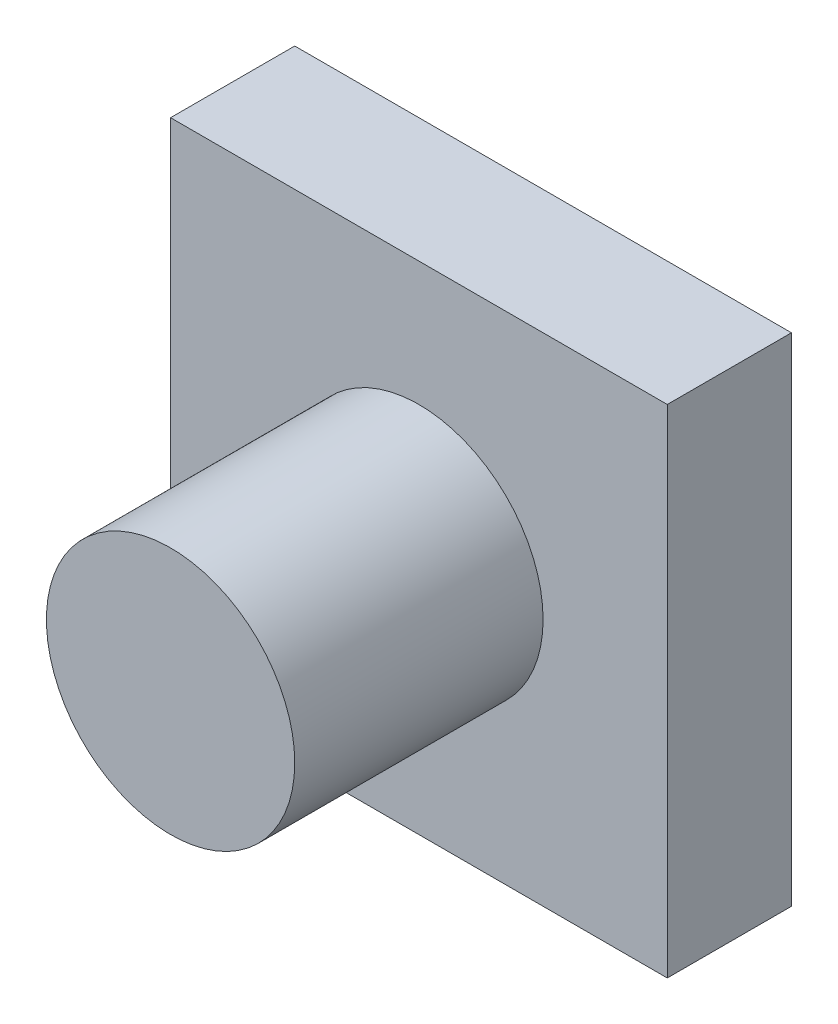
ISO-10303-21;
HEADER;
FILE_DESCRIPTION(('STEP AP214'),'2;1');
FILE_NAME('part.step','',(''),(''),'','','');
FILE_SCHEMA(('AUTOMOTIVE_DESIGN { 1 0 10303 214 1 1 1 1 }'));
ENDSEC;
DATA;
#1=APPLICATION_CONTEXT('core data for automotive mechanical design processes');
#2=APPLICATION_PROTOCOL_DEFINITION('international standard','automotive_design',2000,#1);
#3=PRODUCT_CONTEXT('',#1,'mechanical');
#4=PRODUCT('Part','Part','',(#3));
#5=PRODUCT_RELATED_PRODUCT_CATEGORY('part','',(#4));
#6=PRODUCT_DEFINITION_FORMATION('','',#4);
#7=PRODUCT_DEFINITION_CONTEXT('part definition',#1,'design');
#8=PRODUCT_DEFINITION('design','',#6,#7);
#9=PRODUCT_DEFINITION_SHAPE('','',#8);
#10=(LENGTH_UNIT() NAMED_UNIT(*) SI_UNIT(.MILLI.,.METRE.));
#11=(NAMED_UNIT(*) PLANE_ANGLE_UNIT() SI_UNIT($,.RADIAN.));
#12=(NAMED_UNIT(*) SI_UNIT($,.STERADIAN.) SOLID_ANGLE_UNIT());
#13=UNCERTAINTY_MEASURE_WITH_UNIT(LENGTH_MEASURE(1.E-05),#10,'distance_accuracy_value','');
#14=(GEOMETRIC_REPRESENTATION_CONTEXT(3) GLOBAL_UNCERTAINTY_ASSIGNED_CONTEXT((#13)) GLOBAL_UNIT_ASSIGNED_CONTEXT((#10,
#11,#12)) REPRESENTATION_CONTEXT('',''));
#15=CARTESIAN_POINT('',(0.,0.,0.));
#16=DIRECTION('',(0.,0.,1.));
#17=DIRECTION('',(1.,0.,0.));
#18=AXIS2_PLACEMENT_3D('',#15,#16,#17);
#19=CARTESIAN_POINT('',(20.,20.,10.));
#20=DIRECTION('',(-1.,0.,0.));
#21=DIRECTION('',(0.,-1.,0.));
#22=AXIS2_PLACEMENT_3D('',#19,#20,#21);
#23=PLANE('',#22);
#24=DIRECTION('',(0.,1.,0.));
#25=VECTOR('',#24,1.);
#26=CARTESIAN_POINT('',(20.,20.,0.));
#27=LINE('',#26,#25);
#28=CARTESIAN_POINT('',(20.,-20.,0.));
#29=VERTEX_POINT('',#28);
#30=CARTESIAN_POINT('',(20.,20.,0.));
#31=VERTEX_POINT('',#30);
#32=EDGE_CURVE('E99',#29,#31,#27,.T.);
#33=ORIENTED_EDGE('',*,*,#32,.T.);
#34=DIRECTION('',(0.,0.,-1.));
#35=VECTOR('',#34,1.);
#36=CARTESIAN_POINT('',(20.,20.,10.));
#37=LINE('',#36,#35);
#38=CARTESIAN_POINT('',(20.,20.,10.));
#39=VERTEX_POINT('',#38);
#40=EDGE_CURVE('E36',#39,#31,#37,.T.);
#41=ORIENTED_EDGE('',*,*,#40,.F.);
#42=DIRECTION('',(0.,1.,0.));
#43=VECTOR('',#42,1.);
#44=CARTESIAN_POINT('',(20.,20.,10.));
#45=LINE('',#44,#43);
#46=CARTESIAN_POINT('',(20.,-20.,10.));
#47=VERTEX_POINT('',#46);
#48=EDGE_CURVE('E86',#47,#39,#45,.T.);
#49=ORIENTED_EDGE('',*,*,#48,.F.);
#50=DIRECTION('',(0.,0.,-1.));
#51=VECTOR('',#50,1.);
#52=CARTESIAN_POINT('',(20.,-20.,10.));
#53=LINE('',#52,#51);
#54=EDGE_CURVE('E95',#47,#29,#53,.T.);
#55=ORIENTED_EDGE('',*,*,#54,.T.);
#56=EDGE_LOOP('',(#33,#41,#49,#55));
#57=FACE_BOUND('',#56,.T.);
#58=ADVANCED_FACE('F33',(#57),#23,.F.);
#59=CARTESIAN_POINT('',(-20.,20.,10.));
#60=DIRECTION('',(0.,-1.,0.));
#61=DIRECTION('',(0.,0.,-1.));
#62=AXIS2_PLACEMENT_3D('',#59,#60,#61);
#63=PLANE('',#62);
#64=DIRECTION('',(-1.,0.,0.));
#65=VECTOR('',#64,1.);
#66=CARTESIAN_POINT('',(-20.,20.,0.));
#67=LINE('',#66,#65);
#68=CARTESIAN_POINT('',(-20.,20.,0.));
#69=VERTEX_POINT('',#68);
#70=EDGE_CURVE('E91',#31,#69,#67,.T.);
#71=ORIENTED_EDGE('',*,*,#70,.T.);
#72=DIRECTION('',(0.,0.,-1.));
#73=VECTOR('',#72,1.);
#74=CARTESIAN_POINT('',(-20.,20.,10.));
#75=LINE('',#74,#73);
#76=CARTESIAN_POINT('',(-20.,20.,10.));
#77=VERTEX_POINT('',#76);
#78=EDGE_CURVE('E89',#77,#69,#75,.T.);
#79=ORIENTED_EDGE('',*,*,#78,.F.);
#80=DIRECTION('',(-1.,0.,0.));
#81=VECTOR('',#80,1.);
#82=CARTESIAN_POINT('',(-20.,20.,10.));
#83=LINE('',#82,#81);
#84=EDGE_CURVE('E81',#39,#77,#83,.T.);
#85=ORIENTED_EDGE('',*,*,#84,.F.);
#86=ORIENTED_EDGE('',*,*,#40,.T.);
#87=EDGE_LOOP('',(#71,#79,#85,#86));
#88=FACE_BOUND('',#87,.T.);
#89=ADVANCED_FACE('F90',(#88),#63,.F.);
#90=CARTESIAN_POINT('',(-20.,20.,10.));
#91=DIRECTION('',(1.,0.,0.));
#92=DIRECTION('',(0.,1.,0.));
#93=AXIS2_PLACEMENT_3D('',#90,#91,#92);
#94=PLANE('',#93);
#95=DIRECTION('',(0.,-1.,0.));
#96=VECTOR('',#95,1.);
#97=CARTESIAN_POINT('',(-20.,20.,0.));
#98=LINE('',#97,#96);
#99=CARTESIAN_POINT('',(-20.,-20.,0.));
#100=VERTEX_POINT('',#99);
#101=EDGE_CURVE('E67',#69,#100,#98,.T.);
#102=ORIENTED_EDGE('',*,*,#101,.T.);
#103=DIRECTION('',(0.,0.,-1.));
#104=VECTOR('',#103,1.);
#105=CARTESIAN_POINT('',(-20.,-20.,10.));
#106=LINE('',#105,#104);
#107=CARTESIAN_POINT('',(-20.,-20.,10.));
#108=VERTEX_POINT('',#107);
#109=EDGE_CURVE('E92',#108,#100,#106,.T.);
#110=ORIENTED_EDGE('',*,*,#109,.F.);
#111=DIRECTION('',(0.,-1.,0.));
#112=VECTOR('',#111,1.);
#113=CARTESIAN_POINT('',(-20.,20.,10.));
#114=LINE('',#113,#112);
#115=EDGE_CURVE('E84',#77,#108,#114,.T.);
#116=ORIENTED_EDGE('',*,*,#115,.F.);
#117=ORIENTED_EDGE('',*,*,#78,.T.);
#118=EDGE_LOOP('',(#102,#110,#116,#117));
#119=FACE_BOUND('',#118,.T.);
#120=ADVANCED_FACE('F93',(#119),#94,.F.);
#121=CARTESIAN_POINT('',(-20.,-20.,10.));
#122=DIRECTION('',(0.,1.,0.));
#123=DIRECTION('',(0.,0.,1.));
#124=AXIS2_PLACEMENT_3D('',#121,#122,#123);
#125=PLANE('',#124);
#126=DIRECTION('',(1.,0.,0.));
#127=VECTOR('',#126,1.);
#128=CARTESIAN_POINT('',(-20.,-20.,0.));
#129=LINE('',#128,#127);
#130=EDGE_CURVE('E73',#100,#29,#129,.T.);
#131=ORIENTED_EDGE('',*,*,#130,.T.);
#132=ORIENTED_EDGE('',*,*,#54,.F.);
#133=DIRECTION('',(1.,0.,0.));
#134=VECTOR('',#133,1.);
#135=CARTESIAN_POINT('',(-20.,-20.,10.));
#136=LINE('',#135,#134);
#137=EDGE_CURVE('E50',#108,#47,#136,.T.);
#138=ORIENTED_EDGE('',*,*,#137,.F.);
#139=ORIENTED_EDGE('',*,*,#109,.T.);
#140=EDGE_LOOP('',(#131,#132,#138,#139));
#141=FACE_BOUND('',#140,.T.);
#142=ADVANCED_FACE('F107',(#141),#125,.F.);
#143=CARTESIAN_POINT('',(0.,0.,10.));
#144=DIRECTION('',(0.,0.,1.));
#145=DIRECTION('',(1.,0.,0.));
#146=AXIS2_PLACEMENT_3D('',#143,#144,#145);
#147=PLANE('',#146);
#148=CARTESIAN_POINT('',(0.,0.,10.));
#149=DIRECTION('',(0.,0.,1.));
#150=DIRECTION('',(1.,0.,0.));
#151=AXIS2_PLACEMENT_3D('',#148,#149,#150);
#152=CIRCLE('',#151,10.);
#153=CARTESIAN_POINT('',(10.,0.,10.));
#154=VERTEX_POINT('',#153);
#155=EDGE_CURVE('E11',#154,#154,#152,.T.);
#156=ORIENTED_EDGE('',*,*,#155,.F.);
#157=EDGE_LOOP('',(#156));
#158=FACE_BOUND('',#157,.T.);
#159=ORIENTED_EDGE('',*,*,#48,.T.);
#160=ORIENTED_EDGE('',*,*,#84,.T.);
#161=ORIENTED_EDGE('',*,*,#115,.T.);
#162=ORIENTED_EDGE('',*,*,#137,.T.);
#163=EDGE_LOOP('',(#159,#160,#161,#162));
#164=FACE_BOUND('',#163,.T.);
#165=ADVANCED_FACE('F82',(#158,#164),#147,.T.);
#166=CARTESIAN_POINT('',(0.,0.,0.));
#167=DIRECTION('',(0.,0.,1.));
#168=DIRECTION('',(1.,0.,0.));
#169=AXIS2_PLACEMENT_3D('',#166,#167,#168);
#170=PLANE('',#169);
#171=ORIENTED_EDGE('',*,*,#32,.F.);
#172=ORIENTED_EDGE('',*,*,#130,.F.);
#173=ORIENTED_EDGE('',*,*,#101,.F.);
#174=ORIENTED_EDGE('',*,*,#70,.F.);
#175=EDGE_LOOP('',(#171,#172,#173,#174));
#176=FACE_BOUND('',#175,.T.);
#177=ADVANCED_FACE('F110',(#176),#170,.F.);
#178=CARTESIAN_POINT('',(0.,0.,30.));
#179=DIRECTION('',(0.,0.,-1.));
#180=DIRECTION('',(-1.,0.,0.));
#181=AXIS2_PLACEMENT_3D('',#178,#179,#180);
#182=CYLINDRICAL_SURFACE('',#181,10.);
#183=CARTESIAN_POINT('',(0.,0.,30.));
#184=DIRECTION('',(0.,0.,1.));
#185=DIRECTION('',(1.,0.,0.));
#186=AXIS2_PLACEMENT_3D('',#183,#184,#185);
#187=CIRCLE('',#186,10.);
#188=CARTESIAN_POINT('',(10.,0.,30.));
#189=VERTEX_POINT('',#188);
#190=EDGE_CURVE('E102',#189,#189,#187,.T.);
#191=ORIENTED_EDGE('',*,*,#190,.F.);
#192=EDGE_LOOP('',(#191));
#193=FACE_BOUND('',#192,.T.);
#194=ORIENTED_EDGE('',*,*,#155,.T.);
#195=EDGE_LOOP('',(#194));
#196=FACE_BOUND('',#195,.T.);
#197=ADVANCED_FACE('F118',(#193,#196),#182,.T.);
#198=CARTESIAN_POINT('',(0.,0.,30.));
#199=DIRECTION('',(0.,0.,1.));
#200=DIRECTION('',(1.,0.,0.));
#201=AXIS2_PLACEMENT_3D('',#198,#199,#200);
#202=PLANE('',#201);
#203=ORIENTED_EDGE('',*,*,#190,.T.);
#204=EDGE_LOOP('',(#203));
#205=FACE_BOUND('',#204,.T.);
#206=ADVANCED_FACE('F116',(#205),#202,.T.);
#207=CLOSED_SHELL('',(#58,#89,#120,#142,#165,#177,#197,#206));
#208=MANIFOLD_SOLID_BREP('B2',#207);
#209=ADVANCED_BREP_SHAPE_REPRESENTATION('',(#18,#208),#14);
#210=SHAPE_DEFINITION_REPRESENTATION(#9,#209);
ENDSEC;
END-ISO-10303-21;
